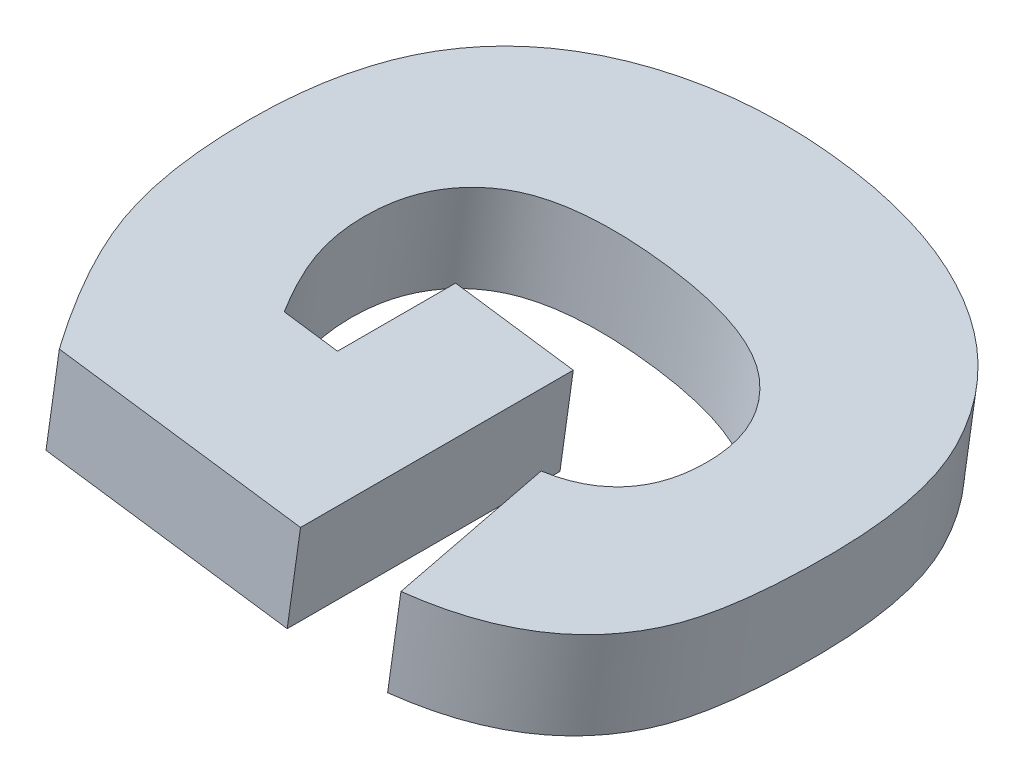
ISO-10303-21;
HEADER;
FILE_DESCRIPTION(('STEP AP214'),'2;1');
FILE_NAME('part.step','',(''),(''),'','','');
FILE_SCHEMA(('AUTOMOTIVE_DESIGN { 1 0 10303 214 1 1 1 1 }'));
ENDSEC;
DATA;
#1=APPLICATION_CONTEXT('core data for automotive mechanical design processes');
#2=APPLICATION_PROTOCOL_DEFINITION('international standard','automotive_design',2000,#1);
#3=PRODUCT_CONTEXT('',#1,'mechanical');
#4=PRODUCT('Part','Part','',(#3));
#5=PRODUCT_RELATED_PRODUCT_CATEGORY('part','',(#4));
#6=PRODUCT_DEFINITION_FORMATION('','',#4);
#7=PRODUCT_DEFINITION_CONTEXT('part definition',#1,'design');
#8=PRODUCT_DEFINITION('design','',#6,#7);
#9=PRODUCT_DEFINITION_SHAPE('','',#8);
#10=(LENGTH_UNIT() NAMED_UNIT(*) SI_UNIT(.MILLI.,.METRE.));
#11=(NAMED_UNIT(*) PLANE_ANGLE_UNIT() SI_UNIT($,.RADIAN.));
#12=(NAMED_UNIT(*) SI_UNIT($,.STERADIAN.) SOLID_ANGLE_UNIT());
#13=UNCERTAINTY_MEASURE_WITH_UNIT(LENGTH_MEASURE(1.E-05),#10,'distance_accuracy_value','');
#14=(GEOMETRIC_REPRESENTATION_CONTEXT(3) GLOBAL_UNCERTAINTY_ASSIGNED_CONTEXT((#13)) GLOBAL_UNIT_ASSIGNED_CONTEXT((#10,
#11,#12)) REPRESENTATION_CONTEXT('',''));
#15=CARTESIAN_POINT('',(0.,0.,0.));
#16=DIRECTION('',(0.,0.,1.));
#17=DIRECTION('',(1.,0.,0.));
#18=AXIS2_PLACEMENT_3D('',#15,#16,#17);
#19=CARTESIAN_POINT('',(702.210621697322,636.967130504926,1594.46862226222));
#20=DIRECTION('',(-0.000106014336864278,-0.000754331202662602,-0.999999709872657));
#21=DIRECTION('',(-0.990268068741567,0.139173100960088,0.));
#22=AXIS2_PLACEMENT_3D('',#19,#20,#21);
#23=PLANE('',#22);
#24=CARTESIAN_POINT('',(700.8188910915,627.064452690548,1594.4762397067));
#25=CARTESIAN_POINT('',(706.999622898448,626.195807483328,1594.4762397067));
#26=CARTESIAN_POINT('',(713.180354705396,625.327162276108,1594.4762397067));
#27=B_SPLINE_CURVE_WITH_KNOTS('',2,(#24,#25,#26),.UNSPECIFIED.,.F.,.F.,(3,3),(0.,1.),.UNSPECIFIED.);
#28=CARTESIAN_POINT('',(700.8188910915,627.064452690548,1594.4762397067));
#29=VERTEX_POINT('',#28);
#30=CARTESIAN_POINT('',(713.180354705396,625.327162276108,1594.4762397067));
#31=VERTEX_POINT('',#30);
#32=EDGE_CURVE('E123',#29,#31,#27,.T.);
#33=ORIENTED_EDGE('',*,*,#32,.F.);
#34=DIRECTION('',(-0.139173060582166,-0.990267781437723,0.000761744447259827));
#35=VECTOR('',#34,1.);
#36=CARTESIAN_POINT('',(702.210621697322,636.967130504926,1594.46862226222));
#37=LINE('',#36,#35);
#38=CARTESIAN_POINT('',(702.210621697322,636.967130504926,1594.46862226222));
#39=VERTEX_POINT('',#38);
#40=EDGE_CURVE('E33',#39,#29,#37,.T.);
#41=ORIENTED_EDGE('',*,*,#40,.F.);
#42=CARTESIAN_POINT('',(702.210621697322,636.967130504926,1594.46862226222));
#43=CARTESIAN_POINT('',(708.39135350427,636.098485297705,1594.46862226222));
#44=CARTESIAN_POINT('',(714.572085311218,635.229840090485,1594.46862226222));
#45=B_SPLINE_CURVE_WITH_KNOTS('',2,(#42,#43,#44),.UNSPECIFIED.,.F.,.F.,(3,3),(0.,1.),.UNSPECIFIED.);
#46=CARTESIAN_POINT('',(714.572085311218,635.229840090485,1594.46862226222));
#47=VERTEX_POINT('',#46);
#48=EDGE_CURVE('E183',#39,#47,#45,.T.);
#49=ORIENTED_EDGE('',*,*,#48,.T.);
#50=DIRECTION('',(-0.139173060582166,-0.990267781437723,0.000761744447259827));
#51=VECTOR('',#50,1.);
#52=CARTESIAN_POINT('',(714.572085311218,635.229840090485,1594.46862226222));
#53=LINE('',#52,#51);
#54=EDGE_CURVE('E11',#47,#31,#53,.T.);
#55=ORIENTED_EDGE('',*,*,#54,.T.);
#56=EDGE_LOOP('',(#33,#41,#49,#55));
#57=FACE_BOUND('',#56,.T.);
#58=ADVANCED_FACE('F17',(#57),#23,.T.);
#59=CARTESIAN_POINT('',(714.572085311218,635.229840090485,1594.46862226222));
#60=DIRECTION('',(0.990268068741567,-0.139173100960088,0.));
#61=DIRECTION('',(-0.000106014336871953,-0.000754331202661523,-0.999999709872657));
#62=AXIS2_PLACEMENT_3D('',#59,#60,#61);
#63=PLANE('',#62);
#64=CARTESIAN_POINT('',(713.180354705396,625.327162276108,1594.4762397067));
#65=CARTESIAN_POINT('',(713.18187332823,625.337967839038,1608.800928593));
#66=CARTESIAN_POINT('',(713.183391951063,625.348773401969,1623.12561747931));
#67=B_SPLINE_CURVE_WITH_KNOTS('',2,(#64,#65,#66),.UNSPECIFIED.,.F.,.F.,(3,3),(1.,2.),.UNSPECIFIED.);
#68=CARTESIAN_POINT('',(713.183391951063,625.348773401969,1623.12561747931));
#69=VERTEX_POINT('',#68);
#70=EDGE_CURVE('E131',#31,#69,#67,.T.);
#71=ORIENTED_EDGE('',*,*,#70,.F.);
#72=ORIENTED_EDGE('',*,*,#54,.F.);
#73=CARTESIAN_POINT('',(714.572085311218,635.229840090485,1594.46862226222));
#74=CARTESIAN_POINT('',(714.573603934051,635.240645653416,1608.79331114853));
#75=CARTESIAN_POINT('',(714.575122556885,635.251451216346,1623.11800003484));
#76=B_SPLINE_CURVE_WITH_KNOTS('',2,(#73,#74,#75),.UNSPECIFIED.,.F.,.F.,(3,3),(1.,2.),.UNSPECIFIED.);
#77=CARTESIAN_POINT('',(714.575122556885,635.251451216346,1623.11800003484));
#78=VERTEX_POINT('',#77);
#79=EDGE_CURVE('E195',#47,#78,#76,.T.);
#80=ORIENTED_EDGE('',*,*,#79,.T.);
#81=DIRECTION('',(-0.139173060582166,-0.990267781437723,0.000761744447259827));
#82=VECTOR('',#81,1.);
#83=CARTESIAN_POINT('',(714.575122556885,635.251451216346,1623.11800003484));
#84=LINE('',#83,#82);
#85=EDGE_CURVE('E25',#78,#69,#84,.T.);
#86=ORIENTED_EDGE('',*,*,#85,.T.);
#87=EDGE_LOOP('',(#71,#72,#80,#86));
#88=FACE_BOUND('',#87,.T.);
#89=ADVANCED_FACE('F194',(#88),#63,.T.);
#90=CARTESIAN_POINT('',(714.575122556885,635.251451216346,1623.11800003484));
#91=DIRECTION('',(0.000106014336864278,0.000754331202662602,0.999999709872657));
#92=DIRECTION('',(0.990268068741567,-0.139173100960088,0.));
#93=AXIS2_PLACEMENT_3D('',#90,#91,#92);
#94=PLANE('',#93);
#95=CARTESIAN_POINT('',(713.183391951063,625.348773401969,1623.12561747931));
#96=CARTESIAN_POINT('',(700.517957920433,627.128784072502,1623.12561747931));
#97=CARTESIAN_POINT('',(687.852523889802,628.908794743035,1623.12561747931));
#98=B_SPLINE_CURVE_WITH_KNOTS('',2,(#95,#96,#97),.UNSPECIFIED.,.F.,.F.,(3,3),(2.,3.),.UNSPECIFIED.);
#99=CARTESIAN_POINT('',(687.852523889802,628.908794743035,1623.12561747931));
#100=VERTEX_POINT('',#99);
#101=EDGE_CURVE('E139',#69,#100,#98,.T.);
#102=ORIENTED_EDGE('',*,*,#101,.F.);
#103=ORIENTED_EDGE('',*,*,#85,.F.);
#104=CARTESIAN_POINT('',(714.575122556885,635.251451216346,1623.11800003484));
#105=CARTESIAN_POINT('',(701.909688526254,637.031461886879,1623.11800003484));
#106=CARTESIAN_POINT('',(689.244254495624,638.811472557412,1623.11800003484));
#107=B_SPLINE_CURVE_WITH_KNOTS('',2,(#104,#105,#106),.UNSPECIFIED.,.F.,.F.,(3,3),(2.,3.),.UNSPECIFIED.);
#108=CARTESIAN_POINT('',(689.244254495624,638.811472557412,1623.11800003484));
#109=VERTEX_POINT('',#108);
#110=EDGE_CURVE('E204',#78,#109,#107,.T.);
#111=ORIENTED_EDGE('',*,*,#110,.T.);
#112=DIRECTION('',(-0.139173060582166,-0.990267781437723,0.000761744447259827));
#113=VECTOR('',#112,1.);
#114=CARTESIAN_POINT('',(689.244254495624,638.811472557412,1623.11800003484));
#115=LINE('',#114,#113);
#116=EDGE_CURVE('E192',#109,#100,#115,.T.);
#117=ORIENTED_EDGE('',*,*,#116,.T.);
#118=EDGE_LOOP('',(#102,#103,#111,#117));
#119=FACE_BOUND('',#118,.T.);
#120=ADVANCED_FACE('F199',(#119),#94,.T.);
#121=CARTESIAN_POINT('',(689.244254495624,638.811472557412,1623.11800003484));
#122=CARTESIAN_POINT('',(683.690856093197,639.585623754948,1614.89153584584));
#123=CARTESIAN_POINT('',(681.683980979237,639.862807560953,1608.56820889461));
#124=CARTESIAN_POINT('',(679.677105865277,640.139991366957,1602.24488194337));
#125=CARTESIAN_POINT('',(679.676186013732,640.133446283125,1593.56821324651));
#126=CARTESIAN_POINT('',(679.67505355499,640.125388420483,1582.88608810559));
#127=CARTESIAN_POINT('',(683.281455414182,639.613362766938,1576.15348432902));
#128=CARTESIAN_POINT('',(686.887857273374,639.101337113393,1569.42088055245));
#129=CARTESIAN_POINT('',(694.020637046949,638.096041093905,1565.71692528328));
#130=CARTESIAN_POINT('',(701.153416820525,637.090745074417,1562.01297001411));
#131=CARTESIAN_POINT('',(710.394117489273,635.792049289196,1562.01297001411));
#132=CARTESIAN_POINT('',(720.121170824797,634.425001094227,1562.01297001411));
#133=CARTESIAN_POINT('',(727.315566907511,633.417011464021,1566.06481058481));
#134=CARTESIAN_POINT('',(734.509962990225,632.409021833816,1570.1166511555));
#135=CARTESIAN_POINT('',(738.225247988495,631.892891106131,1577.94073642379));
#136=CARTESIAN_POINT('',(741.117728614212,631.491065100627,1584.03206321649));
#137=CARTESIAN_POINT('',(741.118822022652,631.498845105937,1594.34583921463));
#138=CARTESIAN_POINT('',(741.119876380791,631.506347253914,1604.29126606998));
#139=CARTESIAN_POINT('',(739.337106109425,631.760692957277,1609.22305181512));
#140=CARTESIAN_POINT('',(737.554335838059,632.01503866064,1614.15483756026));
#141=CARTESIAN_POINT('',(733.805712309322,632.544376225555,1617.40858832159));
#142=CARTESIAN_POINT('',(730.057088780585,633.07371379047,1620.6623390829));
#143=CARTESIAN_POINT('',(724.302089113962,633.883785560637,1622.29944638419));
#144=B_SPLINE_CURVE_WITH_KNOTS('',2,(#121,#122,#123,#124,#125,#126,#127,#128,#129,#130,#131,
#132,#133,#134,#135,#136,#137,#138,#139,#140,#141,#142,#143),.UNSPECIFIED.,.F.,.F.,(3,2,2,2,2,2,
2,2,2,2,2,3),(3.,4.,5.,6.,7.,8.,9.,10.,11.,12.,13.,14.),.UNSPECIFIED.);
#145=DIRECTION('',(-0.139173060582166,-0.990267781437723,0.000761744447259827));
#146=VECTOR('',#145,1.);
#147=SURFACE_OF_LINEAR_EXTRUSION('',#144,#146);
#148=CARTESIAN_POINT('',(687.852523889802,628.908794743035,1623.12561747931));
#149=CARTESIAN_POINT('',(682.299125487375,629.682945940571,1614.89915329032));
#150=CARTESIAN_POINT('',(680.292250373415,629.960129746576,1608.57582633908));
#151=CARTESIAN_POINT('',(678.285375259455,630.23731355258,1602.25249938784));
#152=CARTESIAN_POINT('',(678.28445540791,630.230768468748,1593.57583069099));
#153=CARTESIAN_POINT('',(678.283322949169,630.222710606106,1582.89370555005));
#154=CARTESIAN_POINT('',(681.88972480836,629.710684952561,1576.16110177349));
#155=CARTESIAN_POINT('',(685.496126667552,629.198659299016,1569.42849799693));
#156=CARTESIAN_POINT('',(692.628906441128,628.193363279528,1565.72454272776));
#157=CARTESIAN_POINT('',(699.761686214703,627.18806726004,1562.02058745858));
#158=CARTESIAN_POINT('',(709.002386883451,625.889371474819,1562.02058745858));
#159=CARTESIAN_POINT('',(718.729440218976,624.52232327985,1562.02058745858));
#160=CARTESIAN_POINT('',(725.92383630169,623.514333649644,1566.07242802928));
#161=CARTESIAN_POINT('',(733.118232384404,622.506344019439,1570.12426859998));
#162=CARTESIAN_POINT('',(736.833517382673,621.990213291754,1577.94835386826));
#163=CARTESIAN_POINT('',(739.72599800839,621.58838728625,1584.03968066096));
#164=CARTESIAN_POINT('',(739.72709141683,621.59616729156,1594.3534566591));
#165=CARTESIAN_POINT('',(739.728145774969,621.603669439537,1604.29888351445));
#166=CARTESIAN_POINT('',(737.945375503604,621.8580151429,1609.2306692596));
#167=CARTESIAN_POINT('',(736.162605232238,622.112360846262,1614.16245500474));
#168=CARTESIAN_POINT('',(732.413981703501,622.641698411177,1617.41620576606));
#169=CARTESIAN_POINT('',(728.665358174763,623.171035976092,1620.66995652738));
#170=CARTESIAN_POINT('',(722.91035850814,623.98110774626,1622.30706382866));
#171=B_SPLINE_CURVE_WITH_KNOTS('',2,(#148,#149,#150,#151,#152,#153,#154,#155,#156,#157,#158,
#159,#160,#161,#162,#163,#164,#165,#166,#167,#168,#169,#170),.UNSPECIFIED.,.F.,.F.,(3,2,2,2,2,2,
2,2,2,2,2,3),(3.,4.,5.,6.,7.,8.,9.,10.,11.,12.,13.,14.),.UNSPECIFIED.);
#172=CARTESIAN_POINT('',(722.91035850814,623.98110774626,1622.30706382866));
#173=VERTEX_POINT('',#172);
#174=EDGE_CURVE('E147',#100,#173,#171,.T.);
#175=ORIENTED_EDGE('',*,*,#174,.F.);
#176=ORIENTED_EDGE('',*,*,#116,.F.);
#177=CARTESIAN_POINT('',(724.302089113962,633.883785560637,1622.29944638419));
#178=VERTEX_POINT('',#177);
#179=EDGE_CURVE('E220',#109,#178,#144,.T.);
#180=ORIENTED_EDGE('',*,*,#179,.T.);
#181=DIRECTION('',(-0.139173060582166,-0.990267781437723,0.000761744447259827));
#182=VECTOR('',#181,1.);
#183=CARTESIAN_POINT('',(724.302089113962,633.883785560637,1622.29944638419));
#184=LINE('',#183,#182);
#185=EDGE_CURVE('E190',#178,#173,#184,.T.);
#186=ORIENTED_EDGE('',*,*,#185,.T.);
#187=EDGE_LOOP('',(#175,#176,#180,#186));
#188=FACE_BOUND('',#187,.T.);
#189=ADVANCED_FACE('F234',(#188),#147,.T.);
#190=CARTESIAN_POINT('',(724.302089113962,633.883785560637,1622.29944638419));
#191=DIRECTION('',(-0.974842350306352,0.13714032116814,0.175712618667776));
#192=DIRECTION('',(0.174107010936897,-0.0237118821756019,0.984441209715598));
#193=AXIS2_PLACEMENT_3D('',#190,#191,#192);
#194=PLANE('',#193);
#195=CARTESIAN_POINT('',(722.91035850814,623.98110774626,1622.30706382866));
#196=CARTESIAN_POINT('',(721.328764286577,624.196507319371,1613.36436519536));
#197=CARTESIAN_POINT('',(719.747170065014,624.411906892481,1604.42166656205));
#198=B_SPLINE_CURVE_WITH_KNOTS('',2,(#195,#196,#197),.UNSPECIFIED.,.F.,.F.,(3,3),(14.,15.),.UNSPECIFIED.);
#199=CARTESIAN_POINT('',(719.747170065014,624.411906892481,1604.42166656205));
#200=VERTEX_POINT('',#199);
#201=EDGE_CURVE('E155',#173,#200,#198,.T.);
#202=ORIENTED_EDGE('',*,*,#201,.F.);
#203=ORIENTED_EDGE('',*,*,#185,.F.);
#204=CARTESIAN_POINT('',(724.302089113962,633.883785560637,1622.29944638419));
#205=CARTESIAN_POINT('',(722.720494892398,634.099185133748,1613.35674775089));
#206=CARTESIAN_POINT('',(721.138900670835,634.314584706858,1604.41404911758));
#207=B_SPLINE_CURVE_WITH_KNOTS('',2,(#204,#205,#206),.UNSPECIFIED.,.F.,.F.,(3,3),(14.,15.),.UNSPECIFIED.);
#208=CARTESIAN_POINT('',(721.138900670835,634.314584706858,1604.41404911758));
#209=VERTEX_POINT('',#208);
#210=EDGE_CURVE('E104',#178,#209,#207,.T.);
#211=ORIENTED_EDGE('',*,*,#210,.T.);
#212=DIRECTION('',(-0.139173060582166,-0.990267781437723,0.000761744447259827));
#213=VECTOR('',#212,1.);
#214=CARTESIAN_POINT('',(721.138900670835,634.314584706858,1604.41404911758));
#215=LINE('',#214,#213);
#216=EDGE_CURVE('E96',#209,#200,#215,.T.);
#217=ORIENTED_EDGE('',*,*,#216,.T.);
#218=EDGE_LOOP('',(#202,#203,#211,#217));
#219=FACE_BOUND('',#218,.T.);
#220=ADVANCED_FACE('F238',(#219),#194,.T.);
#221=CARTESIAN_POINT('',(721.138900670835,634.314584706858,1604.41404911758));
#222=CARTESIAN_POINT('',(724.502722798466,633.840980300767,1603.3090016892));
#223=CARTESIAN_POINT('',(726.285736049486,633.588363487473,1600.66916616587));
#224=CARTESIAN_POINT('',(728.068749300505,633.335746674179,1598.02933064253));
#225=CARTESIAN_POINT('',(728.068315408266,633.332659370485,1593.9365623893));
#226=CARTESIAN_POINT('',(728.067668908832,633.32805928798,1587.83833769199));
#227=CARTESIAN_POINT('',(723.872493163256,633.914866558291,1584.21623778788));
#228=CARTESIAN_POINT('',(719.677317417681,634.501673828602,1580.59413788378));
#229=CARTESIAN_POINT('',(710.598734304525,635.77758547724,1580.59413788378));
#230=CARTESIAN_POINT('',(700.952739746796,637.133241603918,1580.59413788378));
#231=CARTESIAN_POINT('',(696.819130412752,637.717000223587,1584.25716547041));
#232=CARTESIAN_POINT('',(692.685521078707,638.300758843255,1587.92019305706));
#233=CARTESIAN_POINT('',(692.686215306288,638.305698529167,1594.46862226222));
#234=CARTESIAN_POINT('',(692.686545064389,638.308044879974,1597.57912613468));
#235=CARTESIAN_POINT('',(693.57849100579,638.184862368318,1600.40313622941));
#236=CARTESIAN_POINT('',(694.470436947191,638.061679856661,1603.22714632414));
#237=CARTESIAN_POINT('',(696.618880722877,637.762537747227,1606.86971006952));
#238=B_SPLINE_CURVE_WITH_KNOTS('',2,(#221,#222,#223,#224,#225,#226,#227,#228,#229,#230,#231,
#232,#233,#234,#235,#236,#237),.UNSPECIFIED.,.F.,.F.,(3,2,2,2,2,2,2,2,3),(15.,16.,17.,18.,19.,
20.,21.,22.,23.),.UNSPECIFIED.);
#239=DIRECTION('',(-0.139173060582166,-0.990267781437723,0.000761744447259827));
#240=VECTOR('',#239,1.);
#241=SURFACE_OF_LINEAR_EXTRUSION('',#238,#240);
#242=CARTESIAN_POINT('',(719.747170065014,624.411906892481,1604.42166656205));
#243=CARTESIAN_POINT('',(723.110992192645,623.93830248639,1603.31661913368));
#244=CARTESIAN_POINT('',(724.894005443664,623.685685673096,1600.67678361034));
#245=CARTESIAN_POINT('',(726.677018694683,623.433068859802,1598.03694808701));
#246=CARTESIAN_POINT('',(726.676584802445,623.429981556107,1593.94417983378));
#247=CARTESIAN_POINT('',(726.67593830301,623.425381473603,1587.84595513646));
#248=CARTESIAN_POINT('',(722.480762557434,624.012188743914,1584.22385523236));
#249=CARTESIAN_POINT('',(718.285586811859,624.598996014225,1580.60175532824));
#250=CARTESIAN_POINT('',(709.207003698703,625.874907662863,1580.60175532824));
#251=CARTESIAN_POINT('',(699.561009140975,627.230563789541,1580.60175532824));
#252=CARTESIAN_POINT('',(695.42739980693,627.81432240921,1584.26478291489));
#253=CARTESIAN_POINT('',(691.293790472885,628.398081028878,1587.92781050153));
#254=CARTESIAN_POINT('',(691.294484700466,628.403020714789,1594.4762397067));
#255=CARTESIAN_POINT('',(691.294814458567,628.405367065597,1597.58674357915));
#256=CARTESIAN_POINT('',(692.186760399968,628.282184553941,1600.41075367388));
#257=CARTESIAN_POINT('',(693.078706341369,628.159002042284,1603.23476376861));
#258=CARTESIAN_POINT('',(695.227150117056,627.85985993285,1606.87732751399));
#259=B_SPLINE_CURVE_WITH_KNOTS('',2,(#242,#243,#244,#245,#246,#247,#248,#249,#250,#251,#252,
#253,#254,#255,#256,#257,#258),.UNSPECIFIED.,.F.,.F.,(3,2,2,2,2,2,2,2,3),(15.,16.,17.,18.,19.,
20.,21.,22.,23.),.UNSPECIFIED.);
#260=CARTESIAN_POINT('',(695.227150117056,627.85985993285,1606.87732751399));
#261=VERTEX_POINT('',#260);
#262=EDGE_CURVE('E163',#200,#261,#259,.T.);
#263=ORIENTED_EDGE('',*,*,#262,.F.);
#264=ORIENTED_EDGE('',*,*,#216,.F.);
#265=CARTESIAN_POINT('',(696.618880722877,637.762537747227,1606.86971006952));
#266=VERTEX_POINT('',#265);
#267=EDGE_CURVE('E99',#209,#266,#238,.T.);
#268=ORIENTED_EDGE('',*,*,#267,.T.);
#269=DIRECTION('',(-0.139173060582166,-0.990267781437723,0.000761744447259827));
#270=VECTOR('',#269,1.);
#271=CARTESIAN_POINT('',(696.618880722877,637.762537747227,1606.86971006952));
#272=LINE('',#271,#270);
#273=EDGE_CURVE('E85',#266,#261,#272,.T.);
#274=ORIENTED_EDGE('',*,*,#273,.T.);
#275=EDGE_LOOP('',(#263,#264,#268,#274));
#276=FACE_BOUND('',#275,.T.);
#277=ADVANCED_FACE('F100',(#276),#241,.T.);
#278=CARTESIAN_POINT('',(696.618880722877,637.762537747227,1606.86971006952));
#279=DIRECTION('',(-0.000106014336864278,-0.000754331202662602,-0.999999709872657));
#280=DIRECTION('',(-0.990268068741567,0.139173100960088,0.));
#281=AXIS2_PLACEMENT_3D('',#278,#279,#280);
#282=PLANE('',#281);
#283=CARTESIAN_POINT('',(695.227150117056,627.85985993285,1606.87732751399));
#284=CARTESIAN_POINT('',(698.023677951019,627.466833576796,1606.87732751399));
#285=CARTESIAN_POINT('',(700.820205784982,627.073807220742,1606.87732751399));
#286=B_SPLINE_CURVE_WITH_KNOTS('',2,(#283,#284,#285),.UNSPECIFIED.,.F.,.F.,(3,3),(23.,24.),.UNSPECIFIED.);
#287=CARTESIAN_POINT('',(700.820205784982,627.073807220742,1606.87732751399));
#288=VERTEX_POINT('',#287);
#289=EDGE_CURVE('E92',#261,#288,#286,.T.);
#290=ORIENTED_EDGE('',*,*,#289,.F.);
#291=ORIENTED_EDGE('',*,*,#273,.F.);
#292=CARTESIAN_POINT('',(696.618880722877,637.762537747227,1606.86971006952));
#293=CARTESIAN_POINT('',(699.415408556841,637.369511391173,1606.86971006952));
#294=CARTESIAN_POINT('',(702.211936390804,636.976485035119,1606.86971006952));
#295=B_SPLINE_CURVE_WITH_KNOTS('',2,(#292,#293,#294),.UNSPECIFIED.,.F.,.F.,(3,3),(23.,24.),.UNSPECIFIED.);
#296=CARTESIAN_POINT('',(702.211936390804,636.976485035119,1606.86971006952));
#297=VERTEX_POINT('',#296);
#298=EDGE_CURVE('E89',#266,#297,#295,.T.);
#299=ORIENTED_EDGE('',*,*,#298,.T.);
#300=DIRECTION('',(-0.139173060582166,-0.990267781437723,0.000761744447259827));
#301=VECTOR('',#300,1.);
#302=CARTESIAN_POINT('',(702.211936390804,636.976485035119,1606.86971006952));
#303=LINE('',#302,#301);
#304=EDGE_CURVE('E61',#297,#288,#303,.T.);
#305=ORIENTED_EDGE('',*,*,#304,.T.);
#306=EDGE_LOOP('',(#290,#291,#299,#305));
#307=FACE_BOUND('',#306,.T.);
#308=ADVANCED_FACE('F87',(#307),#282,.T.);
#309=CARTESIAN_POINT('',(702.211936390804,636.976485035119,1606.86971006952));
#310=DIRECTION('',(-0.990268068741567,0.139173100960088,0.));
#311=DIRECTION('',(0.000106014336873143,0.000754331202661356,0.999999709872657));
#312=AXIS2_PLACEMENT_3D('',#309,#310,#311);
#313=PLANE('',#312);
#314=CARTESIAN_POINT('',(700.820205784982,627.073807220742,1606.87732751399));
#315=CARTESIAN_POINT('',(700.819548438241,627.069129955645,1600.67678361034));
#316=CARTESIAN_POINT('',(700.8188910915,627.064452690548,1594.4762397067));
#317=B_SPLINE_CURVE_WITH_KNOTS('',2,(#314,#315,#316),.UNSPECIFIED.,.F.,.F.,(3,3),(24.,25.),.UNSPECIFIED.);
#318=EDGE_CURVE('E176',#288,#29,#317,.T.);
#319=ORIENTED_EDGE('',*,*,#318,.F.);
#320=ORIENTED_EDGE('',*,*,#304,.F.);
#321=CARTESIAN_POINT('',(702.211936390804,636.976485035119,1606.86971006952));
#322=CARTESIAN_POINT('',(702.211279044063,636.971807770023,1600.66916616587));
#323=CARTESIAN_POINT('',(702.210621697322,636.967130504926,1594.46862226222));
#324=B_SPLINE_CURVE_WITH_KNOTS('',2,(#321,#322,#323),.UNSPECIFIED.,.F.,.F.,(3,3),(24.,25.),.UNSPECIFIED.);
#325=EDGE_CURVE('E108',#297,#39,#324,.T.);
#326=ORIENTED_EDGE('',*,*,#325,.T.);
#327=ORIENTED_EDGE('',*,*,#40,.T.);
#328=EDGE_LOOP('',(#319,#320,#326,#327));
#329=FACE_BOUND('',#328,.T.);
#330=ADVANCED_FACE('F296',(#329),#313,.T.);
#331=CARTESIAN_POINT('',(719.488006511595,634.514765735418,1563.02593015678));
#332=DIRECTION('',(0.139173060582118,0.99026778143773,-0.000761744447226696));
#333=DIRECTION('',(-0.990268068741574,0.13917310096004,0.));
#334=AXIS2_PLACEMENT_3D('',#331,#332,#333);
#335=PLANE('',#334);
#336=ORIENTED_EDGE('',*,*,#48,.F.);
#337=ORIENTED_EDGE('',*,*,#325,.F.);
#338=ORIENTED_EDGE('',*,*,#298,.F.);
#339=ORIENTED_EDGE('',*,*,#267,.F.);
#340=ORIENTED_EDGE('',*,*,#210,.F.);
#341=ORIENTED_EDGE('',*,*,#179,.F.);
#342=ORIENTED_EDGE('',*,*,#110,.F.);
#343=ORIENTED_EDGE('',*,*,#79,.F.);
#344=EDGE_LOOP('',(#336,#337,#338,#339,#340,#341,#342,#343));
#345=FACE_BOUND('',#344,.T.);
#346=ADVANCED_FACE('F107',(#345),#335,.T.);
#347=CARTESIAN_POINT('',(718.096275905773,624.612087921041,1563.03354760126));
#348=DIRECTION('',(0.139173060582118,0.99026778143773,-0.000761744447226696));
#349=DIRECTION('',(-0.990268068741574,0.13917310096004,0.));
#350=AXIS2_PLACEMENT_3D('',#347,#348,#349);
#351=PLANE('',#350);
#352=ORIENTED_EDGE('',*,*,#32,.T.);
#353=ORIENTED_EDGE('',*,*,#70,.T.);
#354=ORIENTED_EDGE('',*,*,#101,.T.);
#355=ORIENTED_EDGE('',*,*,#174,.T.);
#356=ORIENTED_EDGE('',*,*,#201,.T.);
#357=ORIENTED_EDGE('',*,*,#262,.T.);
#358=ORIENTED_EDGE('',*,*,#289,.T.);
#359=ORIENTED_EDGE('',*,*,#318,.T.);
#360=EDGE_LOOP('',(#352,#353,#354,#355,#356,#357,#358,#359));
#361=FACE_BOUND('',#360,.T.);
#362=ADVANCED_FACE('F202',(#361),#351,.F.);
#363=CLOSED_SHELL('',(#58,#89,#120,#189,#220,#277,#308,#330,#346,#362));
#364=MANIFOLD_SOLID_BREP('B1',#363);
#365=ADVANCED_BREP_SHAPE_REPRESENTATION('',(#18,#364),#14);
#366=SHAPE_DEFINITION_REPRESENTATION(#9,#365);
ENDSEC;
END-ISO-10303-21;
